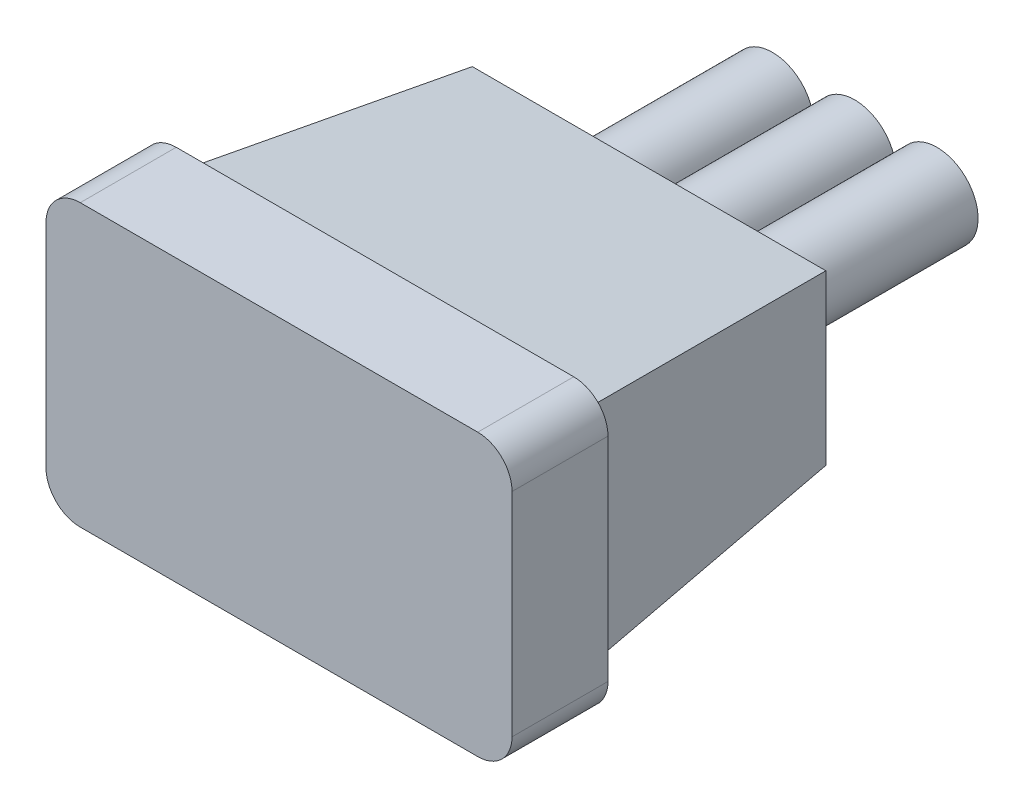
ISO-10303-21;
HEADER;
FILE_DESCRIPTION(('STEP AP214'),'2;1');
FILE_NAME('part.step','',(''),(''),'','','');
FILE_SCHEMA(('AUTOMOTIVE_DESIGN { 1 0 10303 214 1 1 1 1 }'));
ENDSEC;
DATA;
#1=APPLICATION_CONTEXT('core data for automotive mechanical design processes');
#2=APPLICATION_PROTOCOL_DEFINITION('international standard','automotive_design',2000,#1);
#3=PRODUCT_CONTEXT('',#1,'mechanical');
#4=PRODUCT('Part','Part','',(#3));
#5=PRODUCT_RELATED_PRODUCT_CATEGORY('part','',(#4));
#6=PRODUCT_DEFINITION_FORMATION('','',#4);
#7=PRODUCT_DEFINITION_CONTEXT('part definition',#1,'design');
#8=PRODUCT_DEFINITION('design','',#6,#7);
#9=PRODUCT_DEFINITION_SHAPE('','',#8);
#10=(LENGTH_UNIT() NAMED_UNIT(*) SI_UNIT(.MILLI.,.METRE.));
#11=(NAMED_UNIT(*) PLANE_ANGLE_UNIT() SI_UNIT($,.RADIAN.));
#12=(NAMED_UNIT(*) SI_UNIT($,.STERADIAN.) SOLID_ANGLE_UNIT());
#13=UNCERTAINTY_MEASURE_WITH_UNIT(LENGTH_MEASURE(1.E-05),#10,'distance_accuracy_value','');
#14=(GEOMETRIC_REPRESENTATION_CONTEXT(3) GLOBAL_UNCERTAINTY_ASSIGNED_CONTEXT((#13)) GLOBAL_UNIT_ASSIGNED_CONTEXT((#10,
#11,#12)) REPRESENTATION_CONTEXT('',''));
#15=CARTESIAN_POINT('',(0.,0.,0.));
#16=DIRECTION('',(0.,0.,1.));
#17=DIRECTION('',(1.,0.,0.));
#18=AXIS2_PLACEMENT_3D('',#15,#16,#17);
#19=CARTESIAN_POINT('',(1.2,0.,-10.0970562748477));
#20=DIRECTION('',(0.,0.,1.));
#21=DIRECTION('',(1.,0.,0.));
#22=AXIS2_PLACEMENT_3D('',#19,#20,#21);
#23=CYLINDRICAL_SURFACE('',#22,0.6);
#24=CARTESIAN_POINT('',(1.2,0.,-5.4));
#25=DIRECTION('',(0.,0.,-1.));
#26=DIRECTION('',(-1.,0.,0.));
#27=AXIS2_PLACEMENT_3D('',#24,#25,#26);
#28=CIRCLE('',#27,0.6);
#29=CARTESIAN_POINT('',(0.6,0.,-5.4));
#30=VERTEX_POINT('',#29);
#31=EDGE_CURVE('E47',#30,#30,#28,.T.);
#32=ORIENTED_EDGE('',*,*,#31,.T.);
#33=EDGE_LOOP('',(#32));
#34=FACE_BOUND('',#33,.T.);
#35=CARTESIAN_POINT('',(1.2,0.,-8.4));
#36=DIRECTION('',(0.,0.,-1.));
#37=DIRECTION('',(-1.,0.,0.));
#38=AXIS2_PLACEMENT_3D('',#35,#36,#37);
#39=CIRCLE('',#38,0.6);
#40=CARTESIAN_POINT('',(0.6,0.,-8.4));
#41=VERTEX_POINT('',#40);
#42=EDGE_CURVE('E11',#41,#41,#39,.T.);
#43=ORIENTED_EDGE('',*,*,#42,.F.);
#44=EDGE_LOOP('',(#43));
#45=FACE_BOUND('',#44,.T.);
#46=ADVANCED_FACE('F40',(#34,#45),#23,.T.);
#47=CARTESIAN_POINT('',(1.2,0.,-5.4));
#48=DIRECTION('',(0.,0.,-1.));
#49=DIRECTION('',(-1.,0.,0.));
#50=AXIS2_PLACEMENT_3D('',#47,#48,#49);
#51=PLANE('',#50);
#52=ORIENTED_EDGE('',*,*,#31,.F.);
#53=EDGE_LOOP('',(#52));
#54=FACE_BOUND('',#53,.T.);
#55=ADVANCED_FACE('F55',(#54),#51,.F.);
#56=CARTESIAN_POINT('',(0.,0.,-8.4));
#57=DIRECTION('',(0.,0.,-1.));
#58=DIRECTION('',(-1.,0.,0.));
#59=AXIS2_PLACEMENT_3D('',#56,#57,#58);
#60=PLANE('',#59);
#61=ORIENTED_EDGE('',*,*,#42,.T.);
#62=EDGE_LOOP('',(#61));
#63=FACE_BOUND('',#62,.T.);
#64=ADVANCED_FACE('F42',(#63),#60,.T.);
#65=CLOSED_SHELL('',(#46,#55,#64));
#66=MANIFOLD_SOLID_BREP('B2',#65);
#67=CARTESIAN_POINT('',(-1.2,0.,-10.0970562748477));
#68=DIRECTION('',(0.,0.,1.));
#69=DIRECTION('',(1.,0.,0.));
#70=AXIS2_PLACEMENT_3D('',#67,#68,#69);
#71=CYLINDRICAL_SURFACE('',#70,0.6);
#72=CARTESIAN_POINT('',(-1.2,0.,-5.4));
#73=DIRECTION('',(0.,0.,-1.));
#74=DIRECTION('',(-1.,0.,0.));
#75=AXIS2_PLACEMENT_3D('',#72,#73,#74);
#76=CIRCLE('',#75,0.6);
#77=CARTESIAN_POINT('',(-1.8,0.,-5.4));
#78=VERTEX_POINT('',#77);
#79=EDGE_CURVE('E96',#78,#78,#76,.T.);
#80=ORIENTED_EDGE('',*,*,#79,.T.);
#81=EDGE_LOOP('',(#80));
#82=FACE_BOUND('',#81,.T.);
#83=CARTESIAN_POINT('',(-1.2,0.,-8.4));
#84=DIRECTION('',(0.,0.,-1.));
#85=DIRECTION('',(-1.,0.,0.));
#86=AXIS2_PLACEMENT_3D('',#83,#84,#85);
#87=CIRCLE('',#86,0.6);
#88=CARTESIAN_POINT('',(-1.8,0.,-8.4));
#89=VERTEX_POINT('',#88);
#90=EDGE_CURVE('E39',#89,#89,#87,.T.);
#91=ORIENTED_EDGE('',*,*,#90,.F.);
#92=EDGE_LOOP('',(#91));
#93=FACE_BOUND('',#92,.T.);
#94=ADVANCED_FACE('F89',(#82,#93),#71,.T.);
#95=CARTESIAN_POINT('',(-1.2,0.,-5.4));
#96=DIRECTION('',(0.,0.,-1.));
#97=DIRECTION('',(-1.,0.,0.));
#98=AXIS2_PLACEMENT_3D('',#95,#96,#97);
#99=PLANE('',#98);
#100=ORIENTED_EDGE('',*,*,#79,.F.);
#101=EDGE_LOOP('',(#100));
#102=FACE_BOUND('',#101,.T.);
#103=ADVANCED_FACE('F104',(#102),#99,.F.);
#104=CARTESIAN_POINT('',(0.,0.,-8.4));
#105=DIRECTION('',(0.,0.,-1.));
#106=DIRECTION('',(-1.,0.,0.));
#107=AXIS2_PLACEMENT_3D('',#104,#105,#106);
#108=PLANE('',#107);
#109=ORIENTED_EDGE('',*,*,#90,.T.);
#110=EDGE_LOOP('',(#109));
#111=FACE_BOUND('',#110,.T.);
#112=ADVANCED_FACE('F91',(#111),#108,.T.);
#113=CLOSED_SHELL('',(#94,#103,#112));
#114=MANIFOLD_SOLID_BREP('B6',#113);
#115=CARTESIAN_POINT('',(0.,0.,-8.4));
#116=DIRECTION('',(0.,0.,1.));
#117=DIRECTION('',(1.,0.,0.));
#118=AXIS2_PLACEMENT_3D('',#115,#116,#117);
#119=CYLINDRICAL_SURFACE('',#118,0.6);
#120=CARTESIAN_POINT('',(0.,0.,-8.4));
#121=DIRECTION('',(0.,0.,-1.));
#122=DIRECTION('',(-1.,0.,0.));
#123=AXIS2_PLACEMENT_3D('',#120,#121,#122);
#124=CIRCLE('',#123,0.6);
#125=CARTESIAN_POINT('',(-0.6,0.,-8.4));
#126=VERTEX_POINT('',#125);
#127=EDGE_CURVE('E88',#126,#126,#124,.T.);
#128=ORIENTED_EDGE('',*,*,#127,.F.);
#129=EDGE_LOOP('',(#128));
#130=FACE_BOUND('',#129,.T.);
#131=CARTESIAN_POINT('',(0.,0.,-5.4));
#132=DIRECTION('',(0.,0.,-1.));
#133=DIRECTION('',(-1.,0.,0.));
#134=AXIS2_PLACEMENT_3D('',#131,#132,#133);
#135=CIRCLE('',#134,0.6);
#136=CARTESIAN_POINT('',(-0.6,0.,-5.4));
#137=VERTEX_POINT('',#136);
#138=EDGE_CURVE('E142',#137,#137,#135,.T.);
#139=ORIENTED_EDGE('',*,*,#138,.T.);
#140=EDGE_LOOP('',(#139));
#141=FACE_BOUND('',#140,.T.);
#142=ADVANCED_FACE('F139',(#130,#141),#119,.T.);
#143=CARTESIAN_POINT('',(0.,0.,-8.4));
#144=DIRECTION('',(0.,0.,-1.));
#145=DIRECTION('',(-1.,0.,0.));
#146=AXIS2_PLACEMENT_3D('',#143,#144,#145);
#147=PLANE('',#146);
#148=ORIENTED_EDGE('',*,*,#127,.T.);
#149=EDGE_LOOP('',(#148));
#150=FACE_BOUND('',#149,.T.);
#151=ADVANCED_FACE('F154',(#150),#147,.T.);
#152=CARTESIAN_POINT('',(0.,0.,-5.4));
#153=DIRECTION('',(0.,0.,-1.));
#154=DIRECTION('',(-1.,0.,0.));
#155=AXIS2_PLACEMENT_3D('',#152,#153,#154);
#156=PLANE('',#155);
#157=ORIENTED_EDGE('',*,*,#138,.F.);
#158=EDGE_LOOP('',(#157));
#159=FACE_BOUND('',#158,.T.);
#160=ADVANCED_FACE('F152',(#159),#156,.F.);
#161=CLOSED_SHELL('',(#142,#151,#160));
#162=MANIFOLD_SOLID_BREP('B34',#161);
#163=CARTESIAN_POINT('',(0.,0.,-1.4));
#164=DIRECTION('',(0.,0.,1.));
#165=DIRECTION('',(1.,0.,0.));
#166=AXIS2_PLACEMENT_3D('',#163,#164,#165);
#167=PLANE('',#166);
#168=DIRECTION('',(1.,0.,0.));
#169=VECTOR('',#168,1.);
#170=CARTESIAN_POINT('',(-3.4,-2.05,-1.4));
#171=LINE('',#170,#169);
#172=CARTESIAN_POINT('',(-2.9,-2.05,-1.4));
#173=VERTEX_POINT('',#172);
#174=CARTESIAN_POINT('',(2.9,-2.05,-1.4));
#175=VERTEX_POINT('',#174);
#176=EDGE_CURVE('E318',#173,#175,#171,.T.);
#177=ORIENTED_EDGE('',*,*,#176,.F.);
#178=CARTESIAN_POINT('',(-2.9,-1.55,-1.4));
#179=DIRECTION('',(0.,0.,1.));
#180=DIRECTION('',(1.,0.,0.));
#181=AXIS2_PLACEMENT_3D('',#178,#179,#180);
#182=CIRCLE('',#181,0.5);
#183=CARTESIAN_POINT('',(-3.4,-1.55,-1.4));
#184=VERTEX_POINT('',#183);
#185=EDGE_CURVE('E355',#173,#184,#182,.F.);
#186=ORIENTED_EDGE('',*,*,#185,.T.);
#187=DIRECTION('',(0.,-1.,0.));
#188=VECTOR('',#187,1.);
#189=CARTESIAN_POINT('',(-3.4,2.05,-1.4));
#190=LINE('',#189,#188);
#191=CARTESIAN_POINT('',(-3.4,1.55,-1.4));
#192=VERTEX_POINT('',#191);
#193=EDGE_CURVE('E315',#192,#184,#190,.T.);
#194=ORIENTED_EDGE('',*,*,#193,.F.);
#195=CARTESIAN_POINT('',(-2.9,1.55,-1.4));
#196=DIRECTION('',(0.,0.,1.));
#197=DIRECTION('',(1.,0.,0.));
#198=AXIS2_PLACEMENT_3D('',#195,#196,#197);
#199=CIRCLE('',#198,0.5);
#200=CARTESIAN_POINT('',(-2.9,2.05,-1.4));
#201=VERTEX_POINT('',#200);
#202=EDGE_CURVE('E195',#192,#201,#199,.F.);
#203=ORIENTED_EDGE('',*,*,#202,.T.);
#204=DIRECTION('',(-1.,0.,0.));
#205=VECTOR('',#204,1.);
#206=CARTESIAN_POINT('',(-3.4,2.05,-1.4));
#207=LINE('',#206,#205);
#208=CARTESIAN_POINT('',(2.9,2.05,-1.4));
#209=VERTEX_POINT('',#208);
#210=EDGE_CURVE('E312',#209,#201,#207,.T.);
#211=ORIENTED_EDGE('',*,*,#210,.F.);
#212=CARTESIAN_POINT('',(2.9,1.55,-1.4));
#213=DIRECTION('',(0.,0.,1.));
#214=DIRECTION('',(1.,0.,0.));
#215=AXIS2_PLACEMENT_3D('',#212,#213,#214);
#216=CIRCLE('',#215,0.5);
#217=CARTESIAN_POINT('',(3.4,1.55,-1.4));
#218=VERTEX_POINT('',#217);
#219=EDGE_CURVE('E350',#209,#218,#216,.F.);
#220=ORIENTED_EDGE('',*,*,#219,.T.);
#221=DIRECTION('',(0.,1.,0.));
#222=VECTOR('',#221,1.);
#223=CARTESIAN_POINT('',(3.4,2.05,-1.4));
#224=LINE('',#223,#222);
#225=CARTESIAN_POINT('',(3.4,-1.55,-1.4));
#226=VERTEX_POINT('',#225);
#227=EDGE_CURVE('E309',#226,#218,#224,.T.);
#228=ORIENTED_EDGE('',*,*,#227,.F.);
#229=CARTESIAN_POINT('',(2.9,-1.55,-1.4));
#230=DIRECTION('',(0.,0.,1.));
#231=DIRECTION('',(1.,0.,0.));
#232=AXIS2_PLACEMENT_3D('',#229,#230,#231);
#233=CIRCLE('',#232,0.5);
#234=EDGE_CURVE('E352',#226,#175,#233,.F.);
#235=ORIENTED_EDGE('',*,*,#234,.T.);
#236=EDGE_LOOP('',(#177,#186,#194,#203,#211,#220,#228,#235));
#237=FACE_BOUND('',#236,.T.);
#238=DIRECTION('',(0.,-1.,0.));
#239=VECTOR('',#238,1.);
#240=CARTESIAN_POINT('',(3.,1.65,-1.4));
#241=LINE('',#240,#239);
#242=CARTESIAN_POINT('',(3.,1.65,-1.4));
#243=VERTEX_POINT('',#242);
#244=CARTESIAN_POINT('',(3.,-1.65,-1.4));
#245=VERTEX_POINT('',#244);
#246=EDGE_CURVE('E269',#243,#245,#241,.T.);
#247=ORIENTED_EDGE('',*,*,#246,.F.);
#248=DIRECTION('',(1.,0.,0.));
#249=VECTOR('',#248,1.);
#250=CARTESIAN_POINT('',(-3.,1.65,-1.4));
#251=LINE('',#250,#249);
#252=CARTESIAN_POINT('',(-3.,1.65,-1.4));
#253=VERTEX_POINT('',#252);
#254=EDGE_CURVE('E271',#253,#243,#251,.T.);
#255=ORIENTED_EDGE('',*,*,#254,.F.);
#256=DIRECTION('',(0.,1.,0.));
#257=VECTOR('',#256,1.);
#258=CARTESIAN_POINT('',(-3.,1.65,-1.4));
#259=LINE('',#258,#257);
#260=CARTESIAN_POINT('',(-3.,-1.65,-1.4));
#261=VERTEX_POINT('',#260);
#262=EDGE_CURVE('E290',#261,#253,#259,.T.);
#263=ORIENTED_EDGE('',*,*,#262,.F.);
#264=DIRECTION('',(-1.,0.,0.));
#265=VECTOR('',#264,1.);
#266=CARTESIAN_POINT('',(-3.,-1.65,-1.4));
#267=LINE('',#266,#265);
#268=EDGE_CURVE('E274',#245,#261,#267,.T.);
#269=ORIENTED_EDGE('',*,*,#268,.F.);
#270=EDGE_LOOP('',(#247,#255,#263,#269));
#271=FACE_BOUND('',#270,.T.);
#272=ADVANCED_FACE('F180',(#237,#271),#167,.F.);
#273=CARTESIAN_POINT('',(3.4,2.05,-1.4));
#274=DIRECTION('',(1.,0.,0.));
#275=DIRECTION('',(0.,1.,0.));
#276=AXIS2_PLACEMENT_3D('',#273,#274,#275);
#277=PLANE('',#276);
#278=DIRECTION('',(0.,1.,0.));
#279=VECTOR('',#278,1.);
#280=CARTESIAN_POINT('',(3.4,2.05,0.));
#281=LINE('',#280,#279);
#282=CARTESIAN_POINT('',(3.4,-1.55,0.));
#283=VERTEX_POINT('',#282);
#284=CARTESIAN_POINT('',(3.4,1.55,0.));
#285=VERTEX_POINT('',#284);
#286=EDGE_CURVE('E322',#283,#285,#281,.T.);
#287=ORIENTED_EDGE('',*,*,#286,.F.);
#288=DIRECTION('',(0.,0.,1.));
#289=VECTOR('',#288,1.);
#290=CARTESIAN_POINT('',(3.4,-1.55,-1.4));
#291=LINE('',#290,#289);
#292=EDGE_CURVE('E137',#283,#226,#291,.F.);
#293=ORIENTED_EDGE('',*,*,#292,.T.);
#294=ORIENTED_EDGE('',*,*,#227,.T.);
#295=DIRECTION('',(0.,0.,1.));
#296=VECTOR('',#295,1.);
#297=CARTESIAN_POINT('',(3.4,1.55,-1.4));
#298=LINE('',#297,#296);
#299=EDGE_CURVE('E188',#218,#285,#298,.T.);
#300=ORIENTED_EDGE('',*,*,#299,.T.);
#301=EDGE_LOOP('',(#287,#293,#294,#300));
#302=FACE_BOUND('',#301,.T.);
#303=ADVANCED_FACE('F364',(#302),#277,.T.);
#304=CARTESIAN_POINT('',(-3.4,-2.05,-1.4));
#305=DIRECTION('',(0.,-1.,0.));
#306=DIRECTION('',(0.,0.,-1.));
#307=AXIS2_PLACEMENT_3D('',#304,#305,#306);
#308=PLANE('',#307);
#309=DIRECTION('',(1.,0.,0.));
#310=VECTOR('',#309,1.);
#311=CARTESIAN_POINT('',(-3.4,-2.05,0.));
#312=LINE('',#311,#310);
#313=CARTESIAN_POINT('',(-2.9,-2.05,0.));
#314=VERTEX_POINT('',#313);
#315=CARTESIAN_POINT('',(2.9,-2.05,0.));
#316=VERTEX_POINT('',#315);
#317=EDGE_CURVE('E313',#314,#316,#312,.T.);
#318=ORIENTED_EDGE('',*,*,#317,.F.);
#319=DIRECTION('',(0.,0.,1.));
#320=VECTOR('',#319,1.);
#321=CARTESIAN_POINT('',(-2.9,-2.05,-1.4));
#322=LINE('',#321,#320);
#323=EDGE_CURVE('E348',#314,#173,#322,.F.);
#324=ORIENTED_EDGE('',*,*,#323,.T.);
#325=ORIENTED_EDGE('',*,*,#176,.T.);
#326=DIRECTION('',(0.,0.,1.));
#327=VECTOR('',#326,1.);
#328=CARTESIAN_POINT('',(2.9,-2.05,-1.4));
#329=LINE('',#328,#327);
#330=EDGE_CURVE('E345',#175,#316,#329,.T.);
#331=ORIENTED_EDGE('',*,*,#330,.T.);
#332=EDGE_LOOP('',(#318,#324,#325,#331));
#333=FACE_BOUND('',#332,.T.);
#334=ADVANCED_FACE('F377',(#333),#308,.T.);
#335=CARTESIAN_POINT('',(-3.4,2.05,-1.4));
#336=DIRECTION('',(-1.,0.,0.));
#337=DIRECTION('',(0.,-1.,0.));
#338=AXIS2_PLACEMENT_3D('',#335,#336,#337);
#339=PLANE('',#338);
#340=ORIENTED_EDGE('',*,*,#193,.T.);
#341=DIRECTION('',(0.,0.,1.));
#342=VECTOR('',#341,1.);
#343=CARTESIAN_POINT('',(-3.4,-1.55,-1.4));
#344=LINE('',#343,#342);
#345=CARTESIAN_POINT('',(-3.4,-1.55,0.));
#346=VERTEX_POINT('',#345);
#347=EDGE_CURVE('E334',#184,#346,#344,.T.);
#348=ORIENTED_EDGE('',*,*,#347,.T.);
#349=DIRECTION('',(0.,-1.,0.));
#350=VECTOR('',#349,1.);
#351=CARTESIAN_POINT('',(-3.4,2.05,0.));
#352=LINE('',#351,#350);
#353=CARTESIAN_POINT('',(-3.4,1.55,0.));
#354=VERTEX_POINT('',#353);
#355=EDGE_CURVE('E328',#354,#346,#352,.T.);
#356=ORIENTED_EDGE('',*,*,#355,.F.);
#357=DIRECTION('',(0.,0.,1.));
#358=VECTOR('',#357,1.);
#359=CARTESIAN_POINT('',(-3.4,1.55,-1.4));
#360=LINE('',#359,#358);
#361=EDGE_CURVE('E321',#354,#192,#360,.F.);
#362=ORIENTED_EDGE('',*,*,#361,.T.);
#363=EDGE_LOOP('',(#340,#348,#356,#362));
#364=FACE_BOUND('',#363,.T.);
#365=ADVANCED_FACE('F386',(#364),#339,.T.);
#366=CARTESIAN_POINT('',(-3.4,2.05,-1.4));
#367=DIRECTION('',(0.,1.,0.));
#368=DIRECTION('',(0.,0.,1.));
#369=AXIS2_PLACEMENT_3D('',#366,#367,#368);
#370=PLANE('',#369);
#371=ORIENTED_EDGE('',*,*,#210,.T.);
#372=DIRECTION('',(0.,0.,1.));
#373=VECTOR('',#372,1.);
#374=CARTESIAN_POINT('',(-2.9,2.05,-1.4));
#375=LINE('',#374,#373);
#376=CARTESIAN_POINT('',(-2.9,2.05,0.));
#377=VERTEX_POINT('',#376);
#378=EDGE_CURVE('E358',#201,#377,#375,.T.);
#379=ORIENTED_EDGE('',*,*,#378,.T.);
#380=DIRECTION('',(-1.,0.,0.));
#381=VECTOR('',#380,1.);
#382=CARTESIAN_POINT('',(-3.4,2.05,0.));
#383=LINE('',#382,#381);
#384=CARTESIAN_POINT('',(2.9,2.05,0.));
#385=VERTEX_POINT('',#384);
#386=EDGE_CURVE('E325',#385,#377,#383,.T.);
#387=ORIENTED_EDGE('',*,*,#386,.F.);
#388=DIRECTION('',(0.,0.,1.));
#389=VECTOR('',#388,1.);
#390=CARTESIAN_POINT('',(2.9,2.05,-1.4));
#391=LINE('',#390,#389);
#392=EDGE_CURVE('E202',#385,#209,#391,.F.);
#393=ORIENTED_EDGE('',*,*,#392,.T.);
#394=EDGE_LOOP('',(#371,#379,#387,#393));
#395=FACE_BOUND('',#394,.T.);
#396=ADVANCED_FACE('F391',(#395),#370,.T.);
#397=CARTESIAN_POINT('',(0.,0.,0.));
#398=DIRECTION('',(0.,0.,1.));
#399=DIRECTION('',(1.,0.,0.));
#400=AXIS2_PLACEMENT_3D('',#397,#398,#399);
#401=PLANE('',#400);
#402=ORIENTED_EDGE('',*,*,#355,.T.);
#403=CARTESIAN_POINT('',(-2.9,-1.55,0.));
#404=DIRECTION('',(0.,0.,1.));
#405=DIRECTION('',(1.,0.,0.));
#406=AXIS2_PLACEMENT_3D('',#403,#404,#405);
#407=CIRCLE('',#406,0.5);
#408=EDGE_CURVE('E343',#346,#314,#407,.T.);
#409=ORIENTED_EDGE('',*,*,#408,.T.);
#410=ORIENTED_EDGE('',*,*,#317,.T.);
#411=CARTESIAN_POINT('',(2.9,-1.55,0.));
#412=DIRECTION('',(0.,0.,1.));
#413=DIRECTION('',(1.,0.,0.));
#414=AXIS2_PLACEMENT_3D('',#411,#412,#413);
#415=CIRCLE('',#414,0.5);
#416=EDGE_CURVE('E339',#316,#283,#415,.T.);
#417=ORIENTED_EDGE('',*,*,#416,.T.);
#418=ORIENTED_EDGE('',*,*,#286,.T.);
#419=CARTESIAN_POINT('',(2.9,1.55,0.));
#420=DIRECTION('',(0.,0.,1.));
#421=DIRECTION('',(1.,0.,0.));
#422=AXIS2_PLACEMENT_3D('',#419,#420,#421);
#423=CIRCLE('',#422,0.5);
#424=EDGE_CURVE('E337',#285,#385,#423,.T.);
#425=ORIENTED_EDGE('',*,*,#424,.T.);
#426=ORIENTED_EDGE('',*,*,#386,.T.);
#427=CARTESIAN_POINT('',(-2.9,1.55,0.));
#428=DIRECTION('',(0.,0.,1.));
#429=DIRECTION('',(1.,0.,0.));
#430=AXIS2_PLACEMENT_3D('',#427,#428,#429);
#431=CIRCLE('',#430,0.5);
#432=EDGE_CURVE('E341',#377,#354,#431,.T.);
#433=ORIENTED_EDGE('',*,*,#432,.T.);
#434=EDGE_LOOP('',(#402,#409,#410,#417,#418,#425,#426,#433));
#435=FACE_BOUND('',#434,.T.);
#436=ADVANCED_FACE('F370',(#435),#401,.T.);
#437=CARTESIAN_POINT('',(3.,1.65,-1.4));
#438=DIRECTION('',(0.994521895368273,0.,-0.104528463267654));
#439=DIRECTION('',(-0.104528463267654,0.,-0.994521895368273));
#440=AXIS2_PLACEMENT_3D('',#437,#438,#439);
#441=PLANE('',#440);
#442=ORIENTED_EDGE('',*,*,#246,.T.);
#443=DIRECTION('',(0.103962051184498,-0.103962051184498,0.989132844377854));
#444=VECTOR('',#443,1.);
#445=CARTESIAN_POINT('',(2.93515135148107,-1.58515135148107,-2.01699367637287));
#446=LINE('',#445,#444);
#447=CARTESIAN_POINT('',(2.57958305893729,-1.22958305893729,-5.4));
#448=VERTEX_POINT('',#447);
#449=EDGE_CURVE('E301',#448,#245,#446,.T.);
#450=ORIENTED_EDGE('',*,*,#449,.F.);
#451=DIRECTION('',(0.,1.,0.));
#452=VECTOR('',#451,1.);
#453=CARTESIAN_POINT('',(2.57958305893729,0.,-5.4));
#454=LINE('',#453,#452);
#455=CARTESIAN_POINT('',(2.57958305893729,1.22958305893729,-5.4));
#456=VERTEX_POINT('',#455);
#457=EDGE_CURVE('E289',#456,#448,#454,.F.);
#458=ORIENTED_EDGE('',*,*,#457,.F.);
#459=DIRECTION('',(0.103962051184498,0.103962051184498,0.989132844377854));
#460=VECTOR('',#459,1.);
#461=CARTESIAN_POINT('',(3.,1.65,-1.4));
#462=LINE('',#461,#460);
#463=EDGE_CURVE('E285',#456,#243,#462,.T.);
#464=ORIENTED_EDGE('',*,*,#463,.T.);
#465=EDGE_LOOP('',(#442,#450,#458,#464));
#466=FACE_BOUND('',#465,.T.);
#467=ADVANCED_FACE('F292',(#466),#441,.T.);
#468=CARTESIAN_POINT('',(-3.,-1.65,-1.4));
#469=DIRECTION('',(0.,-0.994521895368273,-0.104528463267654));
#470=DIRECTION('',(0.,0.104528463267654,-0.994521895368273));
#471=AXIS2_PLACEMENT_3D('',#468,#469,#470);
#472=PLANE('',#471);
#473=ORIENTED_EDGE('',*,*,#268,.T.);
#474=DIRECTION('',(-0.103962051184498,-0.103962051184498,0.989132844377854));
#475=VECTOR('',#474,1.);
#476=CARTESIAN_POINT('',(-2.96433324331459,-1.61433324331459,-1.73934652200508));
#477=LINE('',#476,#475);
#478=CARTESIAN_POINT('',(-2.57958305893729,-1.22958305893729,-5.4));
#479=VERTEX_POINT('',#478);
#480=EDGE_CURVE('E296',#479,#261,#477,.T.);
#481=ORIENTED_EDGE('',*,*,#480,.F.);
#482=DIRECTION('',(1.,0.,0.));
#483=VECTOR('',#482,1.);
#484=CARTESIAN_POINT('',(0.,-1.22958305893729,-5.4));
#485=LINE('',#484,#483);
#486=EDGE_CURVE('E306',#448,#479,#485,.F.);
#487=ORIENTED_EDGE('',*,*,#486,.F.);
#488=ORIENTED_EDGE('',*,*,#449,.T.);
#489=EDGE_LOOP('',(#473,#481,#487,#488));
#490=FACE_BOUND('',#489,.T.);
#491=ADVANCED_FACE('F404',(#490),#472,.T.);
#492=CARTESIAN_POINT('',(-3.,1.65,-1.4));
#493=DIRECTION('',(-0.994521895368273,0.,-0.104528463267654));
#494=DIRECTION('',(-0.104528463267654,0.,0.994521895368273));
#495=AXIS2_PLACEMENT_3D('',#492,#493,#494);
#496=PLANE('',#495);
#497=ORIENTED_EDGE('',*,*,#262,.T.);
#498=DIRECTION('',(-0.103962051184498,0.103962051184498,0.989132844377854));
#499=VECTOR('',#498,1.);
#500=CARTESIAN_POINT('',(-3.,1.65,-1.4));
#501=LINE('',#500,#499);
#502=CARTESIAN_POINT('',(-2.57958305893729,1.22958305893729,-5.4));
#503=VERTEX_POINT('',#502);
#504=EDGE_CURVE('E288',#503,#253,#501,.T.);
#505=ORIENTED_EDGE('',*,*,#504,.F.);
#506=DIRECTION('',(0.,-1.,0.));
#507=VECTOR('',#506,1.);
#508=CARTESIAN_POINT('',(-2.57958305893729,0.,-5.4));
#509=LINE('',#508,#507);
#510=EDGE_CURVE('E298',#479,#503,#509,.F.);
#511=ORIENTED_EDGE('',*,*,#510,.F.);
#512=ORIENTED_EDGE('',*,*,#480,.T.);
#513=EDGE_LOOP('',(#497,#505,#511,#512));
#514=FACE_BOUND('',#513,.T.);
#515=ADVANCED_FACE('F455',(#514),#496,.T.);
#516=CARTESIAN_POINT('',(-3.,1.65,-1.4));
#517=DIRECTION('',(0.,0.994521895368273,-0.104528463267654));
#518=DIRECTION('',(0.,0.104528463267654,0.994521895368273));
#519=AXIS2_PLACEMENT_3D('',#516,#517,#518);
#520=PLANE('',#519);
#521=ORIENTED_EDGE('',*,*,#254,.T.);
#522=ORIENTED_EDGE('',*,*,#463,.F.);
#523=DIRECTION('',(-1.,0.,0.));
#524=VECTOR('',#523,1.);
#525=CARTESIAN_POINT('',(0.,1.22958305893729,-5.4));
#526=LINE('',#525,#524);
#527=EDGE_CURVE('E294',#503,#456,#526,.F.);
#528=ORIENTED_EDGE('',*,*,#527,.F.);
#529=ORIENTED_EDGE('',*,*,#504,.T.);
#530=EDGE_LOOP('',(#521,#522,#528,#529));
#531=FACE_BOUND('',#530,.T.);
#532=ADVANCED_FACE('F283',(#531),#520,.T.);
#533=CARTESIAN_POINT('',(0.,0.,-5.4));
#534=DIRECTION('',(0.,0.,1.));
#535=DIRECTION('',(1.,0.,0.));
#536=AXIS2_PLACEMENT_3D('',#533,#534,#535);
#537=PLANE('',#536);
#538=ORIENTED_EDGE('',*,*,#457,.T.);
#539=ORIENTED_EDGE('',*,*,#486,.T.);
#540=ORIENTED_EDGE('',*,*,#510,.T.);
#541=ORIENTED_EDGE('',*,*,#527,.T.);
#542=EDGE_LOOP('',(#538,#539,#540,#541));
#543=FACE_BOUND('',#542,.T.);
#544=ADVANCED_FACE('F416',(#543),#537,.F.);
#545=CARTESIAN_POINT('',(-2.9,-1.55,-1.4));
#546=DIRECTION('',(0.,0.,1.));
#547=DIRECTION('',(1.,0.,0.));
#548=AXIS2_PLACEMENT_3D('',#545,#546,#547);
#549=CYLINDRICAL_SURFACE('',#548,0.5);
#550=ORIENTED_EDGE('',*,*,#185,.F.);
#551=ORIENTED_EDGE('',*,*,#323,.F.);
#552=ORIENTED_EDGE('',*,*,#408,.F.);
#553=ORIENTED_EDGE('',*,*,#347,.F.);
#554=EDGE_LOOP('',(#550,#551,#552,#553));
#555=FACE_BOUND('',#554,.T.);
#556=ADVANCED_FACE('F383',(#555),#549,.T.);
#557=CARTESIAN_POINT('',(-2.9,1.55,-1.4));
#558=DIRECTION('',(0.,0.,1.));
#559=DIRECTION('',(1.,0.,0.));
#560=AXIS2_PLACEMENT_3D('',#557,#558,#559);
#561=CYLINDRICAL_SURFACE('',#560,0.5);
#562=ORIENTED_EDGE('',*,*,#202,.F.);
#563=ORIENTED_EDGE('',*,*,#361,.F.);
#564=ORIENTED_EDGE('',*,*,#432,.F.);
#565=ORIENTED_EDGE('',*,*,#378,.F.);
#566=EDGE_LOOP('',(#562,#563,#564,#565));
#567=FACE_BOUND('',#566,.T.);
#568=ADVANCED_FACE('F390',(#567),#561,.T.);
#569=CARTESIAN_POINT('',(2.9,-1.55,-1.4));
#570=DIRECTION('',(0.,0.,1.));
#571=DIRECTION('',(1.,0.,0.));
#572=AXIS2_PLACEMENT_3D('',#569,#570,#571);
#573=CYLINDRICAL_SURFACE('',#572,0.5);
#574=ORIENTED_EDGE('',*,*,#234,.F.);
#575=ORIENTED_EDGE('',*,*,#292,.F.);
#576=ORIENTED_EDGE('',*,*,#416,.F.);
#577=ORIENTED_EDGE('',*,*,#330,.F.);
#578=EDGE_LOOP('',(#574,#575,#576,#577));
#579=FACE_BOUND('',#578,.T.);
#580=ADVANCED_FACE('F375',(#579),#573,.T.);
#581=CARTESIAN_POINT('',(2.9,1.55,-1.4));
#582=DIRECTION('',(0.,0.,1.));
#583=DIRECTION('',(1.,0.,0.));
#584=AXIS2_PLACEMENT_3D('',#581,#582,#583);
#585=CYLINDRICAL_SURFACE('',#584,0.5);
#586=ORIENTED_EDGE('',*,*,#219,.F.);
#587=ORIENTED_EDGE('',*,*,#392,.F.);
#588=ORIENTED_EDGE('',*,*,#424,.F.);
#589=ORIENTED_EDGE('',*,*,#299,.F.);
#590=EDGE_LOOP('',(#586,#587,#588,#589));
#591=FACE_BOUND('',#590,.T.);
#592=ADVANCED_FACE('F182',(#591),#585,.T.);
#593=CLOSED_SHELL('',(#272,#303,#334,#365,#396,#436,#467,#491,#515,#532,#544,#556,#568,#580,#592));
#594=MANIFOLD_SOLID_BREP('B83',#593);
#595=ADVANCED_BREP_SHAPE_REPRESENTATION('',(#18,#66,#114,#162,#594),#14);
#596=SHAPE_DEFINITION_REPRESENTATION(#9,#595);
ENDSEC;
END-ISO-10303-21;
